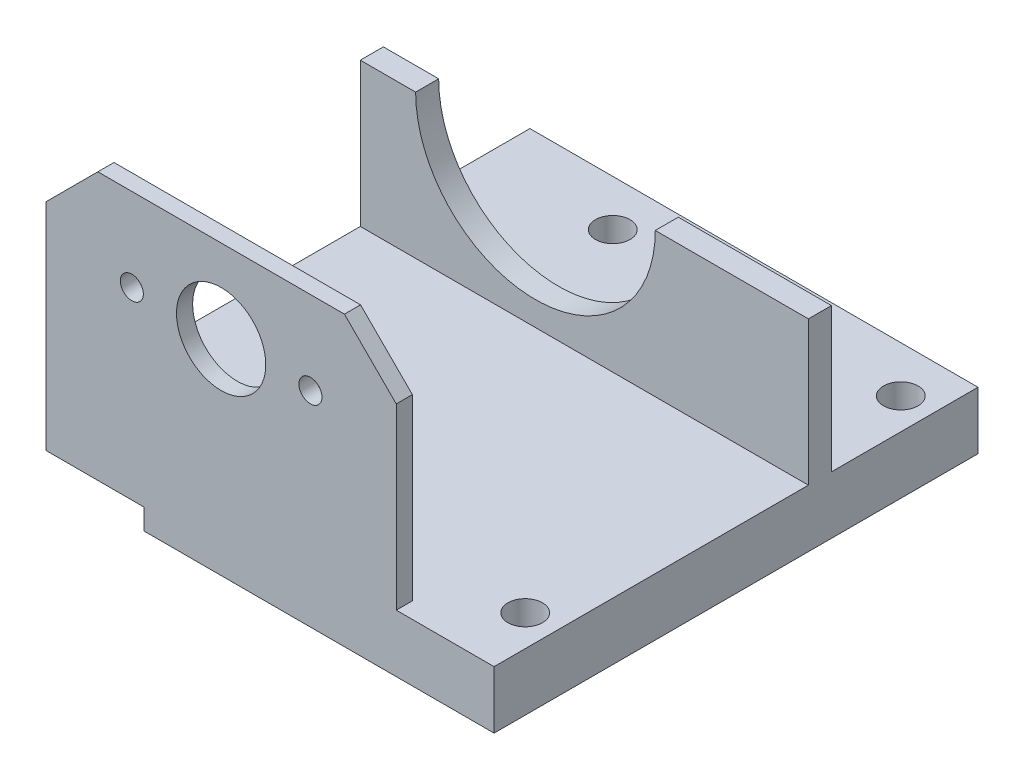
ISO-10303-21;
HEADER;
FILE_DESCRIPTION(('STEP AP214'),'2;1');
FILE_NAME('part.step','',(''),(''),'','','');
FILE_SCHEMA(('AUTOMOTIVE_DESIGN { 1 0 10303 214 1 1 1 1 }'));
ENDSEC;
DATA;
#1=APPLICATION_CONTEXT('core data for automotive mechanical design processes');
#2=APPLICATION_PROTOCOL_DEFINITION('international standard','automotive_design',2000,#1);
#3=PRODUCT_CONTEXT('',#1,'mechanical');
#4=PRODUCT('Part','Part','',(#3));
#5=PRODUCT_RELATED_PRODUCT_CATEGORY('part','',(#4));
#6=PRODUCT_DEFINITION_FORMATION('','',#4);
#7=PRODUCT_DEFINITION_CONTEXT('part definition',#1,'design');
#8=PRODUCT_DEFINITION('design','',#6,#7);
#9=PRODUCT_DEFINITION_SHAPE('','',#8);
#10=(LENGTH_UNIT() NAMED_UNIT(*) SI_UNIT(.MILLI.,.METRE.));
#11=(NAMED_UNIT(*) PLANE_ANGLE_UNIT() SI_UNIT($,.RADIAN.));
#12=(NAMED_UNIT(*) SI_UNIT($,.STERADIAN.) SOLID_ANGLE_UNIT());
#13=UNCERTAINTY_MEASURE_WITH_UNIT(LENGTH_MEASURE(1.E-05),#10,'distance_accuracy_value','');
#14=(GEOMETRIC_REPRESENTATION_CONTEXT(3) GLOBAL_UNCERTAINTY_ASSIGNED_CONTEXT((#13)) GLOBAL_UNIT_ASSIGNED_CONTEXT((#10,
#11,#12)) REPRESENTATION_CONTEXT('',''));
#15=CARTESIAN_POINT('',(0.,0.,0.));
#16=DIRECTION('',(0.,0.,1.));
#17=DIRECTION('',(1.,0.,0.));
#18=AXIS2_PLACEMENT_3D('',#15,#16,#17);
#19=CARTESIAN_POINT('',(0.,17.5,0.));
#20=DIRECTION('',(0.,1.,0.));
#21=DIRECTION('',(0.,0.,1.));
#22=AXIS2_PLACEMENT_3D('',#19,#20,#21);
#23=PLANE('',#22);
#24=DIRECTION('',(0.,0.,-1.));
#25=VECTOR('',#24,1.);
#26=CARTESIAN_POINT('',(1.91,17.5,-6.28));
#27=LINE('',#26,#25);
#28=CARTESIAN_POINT('',(1.91,17.5,-6.28));
#29=VERTEX_POINT('',#28);
#30=CARTESIAN_POINT('',(1.91,17.5,-8.28));
#31=VERTEX_POINT('',#30);
#32=EDGE_CURVE('E11',#29,#31,#27,.T.);
#33=ORIENTED_EDGE('',*,*,#32,.F.);
#34=DIRECTION('',(1.,0.,0.));
#35=VECTOR('',#34,1.);
#36=CARTESIAN_POINT('',(-23.69,17.5,-6.28));
#37=LINE('',#36,#35);
#38=CARTESIAN_POINT('',(15.2,17.5,-6.28));
#39=VERTEX_POINT('',#38);
#40=EDGE_CURVE('E318',#29,#39,#37,.T.);
#41=ORIENTED_EDGE('',*,*,#40,.T.);
#42=DIRECTION('',(0.,0.,-1.));
#43=VECTOR('',#42,1.);
#44=CARTESIAN_POINT('',(15.2,17.5,-8.28));
#45=LINE('',#44,#43);
#46=CARTESIAN_POINT('',(15.2,17.5,-8.28));
#47=VERTEX_POINT('',#46);
#48=EDGE_CURVE('E164',#39,#47,#45,.T.);
#49=ORIENTED_EDGE('',*,*,#48,.T.);
#50=DIRECTION('',(-1.,0.,0.));
#51=VECTOR('',#50,1.);
#52=CARTESIAN_POINT('',(-23.69,17.5,-8.28));
#53=LINE('',#52,#51);
#54=EDGE_CURVE('E160',#47,#31,#53,.T.);
#55=ORIENTED_EDGE('',*,*,#54,.T.);
#56=EDGE_LOOP('',(#33,#41,#49,#55));
#57=FACE_BOUND('',#56,.T.);
#58=ADVANCED_FACE('F33',(#57),#23,.T.);
#59=CARTESIAN_POINT('',(0.,5.,0.));
#60=DIRECTION('',(0.,1.,0.));
#61=DIRECTION('',(0.,0.,1.));
#62=AXIS2_PLACEMENT_3D('',#59,#60,#61);
#63=PLANE('',#62);
#64=CARTESIAN_POINT('',(-12.5,5.,15.6));
#65=DIRECTION('',(0.,1.,0.));
#66=DIRECTION('',(0.,0.,1.));
#67=AXIS2_PLACEMENT_3D('',#64,#65,#66);
#68=CIRCLE('',#67,1.5);
#69=CARTESIAN_POINT('',(-12.5,5.,17.1));
#70=VERTEX_POINT('',#69);
#71=EDGE_CURVE('E187',#70,#70,#68,.T.);
#72=ORIENTED_EDGE('',*,*,#71,.F.);
#73=EDGE_LOOP('',(#72));
#74=FACE_BOUND('',#73,.T.);
#75=CARTESIAN_POINT('',(12.5,5.,15.6));
#76=DIRECTION('',(0.,1.,0.));
#77=DIRECTION('',(0.,0.,1.));
#78=AXIS2_PLACEMENT_3D('',#75,#76,#77);
#79=CIRCLE('',#78,1.5);
#80=CARTESIAN_POINT('',(12.5,5.,17.1));
#81=VERTEX_POINT('',#80);
#82=EDGE_CURVE('E193',#81,#81,#79,.T.);
#83=ORIENTED_EDGE('',*,*,#82,.F.);
#84=EDGE_LOOP('',(#83));
#85=FACE_BOUND('',#84,.T.);
#86=DIRECTION('',(0.,0.,-1.));
#87=VECTOR('',#86,1.);
#88=CARTESIAN_POINT('',(15.2,5.,-21.));
#89=LINE('',#88,#87);
#90=CARTESIAN_POINT('',(15.2,5.,21.));
#91=VERTEX_POINT('',#90);
#92=CARTESIAN_POINT('',(15.2,5.,-6.28));
#93=VERTEX_POINT('',#92);
#94=EDGE_CURVE('E265',#91,#93,#89,.T.);
#95=ORIENTED_EDGE('',*,*,#94,.T.);
#96=DIRECTION('',(1.,0.,0.));
#97=VECTOR('',#96,1.);
#98=CARTESIAN_POINT('',(-23.69,5.,-6.28));
#99=LINE('',#98,#97);
#100=CARTESIAN_POINT('',(-23.69,5.,-6.28));
#101=VERTEX_POINT('',#100);
#102=EDGE_CURVE('E172',#101,#93,#99,.T.);
#103=ORIENTED_EDGE('',*,*,#102,.F.);
#104=DIRECTION('',(0.,0.,-1.));
#105=VECTOR('',#104,1.);
#106=CARTESIAN_POINT('',(-23.69,5.,-21.));
#107=LINE('',#106,#105);
#108=CARTESIAN_POINT('',(-23.69,5.,19.6));
#109=VERTEX_POINT('',#108);
#110=EDGE_CURVE('E253',#109,#101,#107,.T.);
#111=ORIENTED_EDGE('',*,*,#110,.F.);
#112=DIRECTION('',(-1.,0.,0.));
#113=VECTOR('',#112,1.);
#114=CARTESIAN_POINT('',(-23.69,5.,19.6));
#115=LINE('',#114,#113);
#116=CARTESIAN_POINT('',(6.71,5.,19.6));
#117=VERTEX_POINT('',#116);
#118=EDGE_CURVE('E230',#117,#109,#115,.T.);
#119=ORIENTED_EDGE('',*,*,#118,.F.);
#120=DIRECTION('',(0.,0.,-1.));
#121=VECTOR('',#120,1.);
#122=CARTESIAN_POINT('',(6.71,5.,21.));
#123=LINE('',#122,#121);
#124=CARTESIAN_POINT('',(6.71,5.,21.));
#125=VERTEX_POINT('',#124);
#126=EDGE_CURVE('E223',#125,#117,#123,.T.);
#127=ORIENTED_EDGE('',*,*,#126,.F.);
#128=DIRECTION('',(1.,0.,0.));
#129=VECTOR('',#128,1.);
#130=CARTESIAN_POINT('',(-15.2,5.,21.));
#131=LINE('',#130,#129);
#132=EDGE_CURVE('E272',#125,#91,#131,.T.);
#133=ORIENTED_EDGE('',*,*,#132,.T.);
#134=EDGE_LOOP('',(#95,#103,#111,#119,#127,#133));
#135=FACE_BOUND('',#134,.T.);
#136=ADVANCED_FACE('F370',(#74,#85,#135),#63,.T.);
#137=CARTESIAN_POINT('',(-12.5,5.,-17.));
#138=DIRECTION('',(0.,1.,0.));
#139=DIRECTION('',(0.,0.,1.));
#140=AXIS2_PLACEMENT_3D('',#137,#138,#139);
#141=CIRCLE('',#140,1.5);
#142=CARTESIAN_POINT('',(-12.5,5.,-15.5));
#143=VERTEX_POINT('',#142);
#144=EDGE_CURVE('E183',#143,#143,#141,.T.);
#145=ORIENTED_EDGE('',*,*,#144,.F.);
#146=EDGE_LOOP('',(#145));
#147=FACE_BOUND('',#146,.T.);
#148=CARTESIAN_POINT('',(12.5,5.,-17.));
#149=DIRECTION('',(0.,1.,0.));
#150=DIRECTION('',(0.,0.,1.));
#151=AXIS2_PLACEMENT_3D('',#148,#149,#150);
#152=CIRCLE('',#151,1.5);
#153=CARTESIAN_POINT('',(12.5,5.,-15.5));
#154=VERTEX_POINT('',#153);
#155=EDGE_CURVE('E194',#154,#154,#152,.T.);
#156=ORIENTED_EDGE('',*,*,#155,.F.);
#157=EDGE_LOOP('',(#156));
#158=FACE_BOUND('',#157,.T.);
#159=CARTESIAN_POINT('',(-23.69,5.,-8.28));
#160=VERTEX_POINT('',#159);
#161=CARTESIAN_POINT('',(-23.69,5.,-21.));
#162=VERTEX_POINT('',#161);
#163=EDGE_CURVE('E252',#160,#162,#107,.T.);
#164=ORIENTED_EDGE('',*,*,#163,.F.);
#165=DIRECTION('',(-1.,0.,0.));
#166=VECTOR('',#165,1.);
#167=CARTESIAN_POINT('',(-23.69,5.,-8.28));
#168=LINE('',#167,#166);
#169=CARTESIAN_POINT('',(15.2,5.,-8.28));
#170=VERTEX_POINT('',#169);
#171=EDGE_CURVE('E174',#170,#160,#168,.T.);
#172=ORIENTED_EDGE('',*,*,#171,.F.);
#173=CARTESIAN_POINT('',(15.2,5.,-21.));
#174=VERTEX_POINT('',#173);
#175=EDGE_CURVE('E269',#170,#174,#89,.T.);
#176=ORIENTED_EDGE('',*,*,#175,.T.);
#177=DIRECTION('',(-1.,0.,0.));
#178=VECTOR('',#177,1.);
#179=CARTESIAN_POINT('',(-15.2,5.,-21.));
#180=LINE('',#179,#178);
#181=EDGE_CURVE('E268',#174,#162,#180,.T.);
#182=ORIENTED_EDGE('',*,*,#181,.T.);
#183=EDGE_LOOP('',(#164,#172,#176,#182));
#184=FACE_BOUND('',#183,.T.);
#185=ADVANCED_FACE('F332',(#147,#158,#184),#63,.T.);
#186=CARTESIAN_POINT('',(-15.2,5.,-21.));
#187=DIRECTION('',(1.,0.,0.));
#188=DIRECTION('',(0.,0.,-1.));
#189=AXIS2_PLACEMENT_3D('',#186,#187,#188);
#190=PLANE('',#189);
#191=DIRECTION('',(0.,0.,1.));
#192=VECTOR('',#191,1.);
#193=CARTESIAN_POINT('',(-15.2,1.8,-21.));
#194=LINE('',#193,#192);
#195=CARTESIAN_POINT('',(-15.2,1.8,-21.));
#196=VERTEX_POINT('',#195);
#197=CARTESIAN_POINT('',(-15.2,1.8,21.));
#198=VERTEX_POINT('',#197);
#199=EDGE_CURVE('E243',#196,#198,#194,.T.);
#200=ORIENTED_EDGE('',*,*,#199,.F.);
#201=DIRECTION('',(0.,-1.,0.));
#202=VECTOR('',#201,1.);
#203=CARTESIAN_POINT('',(-15.2,5.,-21.));
#204=LINE('',#203,#202);
#205=CARTESIAN_POINT('',(-15.2,0.,-21.));
#206=VERTEX_POINT('',#205);
#207=EDGE_CURVE('E289',#196,#206,#204,.T.);
#208=ORIENTED_EDGE('',*,*,#207,.T.);
#209=DIRECTION('',(0.,0.,1.));
#210=VECTOR('',#209,1.);
#211=CARTESIAN_POINT('',(-15.2,0.,-21.));
#212=LINE('',#211,#210);
#213=CARTESIAN_POINT('',(-15.2,0.,21.));
#214=VERTEX_POINT('',#213);
#215=EDGE_CURVE('E280',#206,#214,#212,.T.);
#216=ORIENTED_EDGE('',*,*,#215,.T.);
#217=DIRECTION('',(0.,-1.,0.));
#218=VECTOR('',#217,1.);
#219=CARTESIAN_POINT('',(-15.2,5.,21.));
#220=LINE('',#219,#218);
#221=EDGE_CURVE('E287',#198,#214,#220,.T.);
#222=ORIENTED_EDGE('',*,*,#221,.F.);
#223=EDGE_LOOP('',(#200,#208,#216,#222));
#224=FACE_BOUND('',#223,.T.);
#225=ADVANCED_FACE('F379',(#224),#190,.F.);
#226=CARTESIAN_POINT('',(15.2,5.,-21.));
#227=DIRECTION('',(-1.,0.,0.));
#228=DIRECTION('',(0.,0.,1.));
#229=AXIS2_PLACEMENT_3D('',#226,#227,#228);
#230=PLANE('',#229);
#231=DIRECTION('',(0.,0.,-1.));
#232=VECTOR('',#231,1.);
#233=CARTESIAN_POINT('',(15.2,0.,-21.));
#234=LINE('',#233,#232);
#235=CARTESIAN_POINT('',(15.2,0.,21.));
#236=VERTEX_POINT('',#235);
#237=CARTESIAN_POINT('',(15.2,0.,-21.));
#238=VERTEX_POINT('',#237);
#239=EDGE_CURVE('E264',#236,#238,#234,.T.);
#240=ORIENTED_EDGE('',*,*,#239,.T.);
#241=DIRECTION('',(0.,-1.,0.));
#242=VECTOR('',#241,1.);
#243=CARTESIAN_POINT('',(15.2,5.,-21.));
#244=LINE('',#243,#242);
#245=EDGE_CURVE('E291',#174,#238,#244,.T.);
#246=ORIENTED_EDGE('',*,*,#245,.F.);
#247=ORIENTED_EDGE('',*,*,#175,.F.);
#248=DIRECTION('',(0.,-1.,0.));
#249=VECTOR('',#248,1.);
#250=CARTESIAN_POINT('',(15.2,17.5,-8.28));
#251=LINE('',#250,#249);
#252=EDGE_CURVE('E167',#47,#170,#251,.T.);
#253=ORIENTED_EDGE('',*,*,#252,.F.);
#254=ORIENTED_EDGE('',*,*,#48,.F.);
#255=DIRECTION('',(0.,-1.,0.));
#256=VECTOR('',#255,1.);
#257=CARTESIAN_POINT('',(15.2,17.5,-6.28));
#258=LINE('',#257,#256);
#259=EDGE_CURVE('E178',#39,#93,#258,.T.);
#260=ORIENTED_EDGE('',*,*,#259,.T.);
#261=ORIENTED_EDGE('',*,*,#94,.F.);
#262=DIRECTION('',(0.,-1.,0.));
#263=VECTOR('',#262,1.);
#264=CARTESIAN_POINT('',(15.2,5.,21.));
#265=LINE('',#264,#263);
#266=EDGE_CURVE('E274',#91,#236,#265,.T.);
#267=ORIENTED_EDGE('',*,*,#266,.T.);
#268=EDGE_LOOP('',(#240,#246,#247,#253,#254,#260,#261,#267));
#269=FACE_BOUND('',#268,.T.);
#270=ADVANCED_FACE('F326',(#269),#230,.F.);
#271=CARTESIAN_POINT('',(-15.2,5.,-21.));
#272=DIRECTION('',(0.,0.,1.));
#273=DIRECTION('',(1.,0.,0.));
#274=AXIS2_PLACEMENT_3D('',#271,#272,#273);
#275=PLANE('',#274);
#276=DIRECTION('',(-1.,0.,0.));
#277=VECTOR('',#276,1.);
#278=CARTESIAN_POINT('',(-15.2,0.,-21.));
#279=LINE('',#278,#277);
#280=EDGE_CURVE('E277',#238,#206,#279,.T.);
#281=ORIENTED_EDGE('',*,*,#280,.T.);
#282=ORIENTED_EDGE('',*,*,#207,.F.);
#283=DIRECTION('',(1.,0.,0.));
#284=VECTOR('',#283,1.);
#285=CARTESIAN_POINT('',(-23.69,1.8,-21.));
#286=LINE('',#285,#284);
#287=CARTESIAN_POINT('',(-23.69,1.8,-21.));
#288=VERTEX_POINT('',#287);
#289=EDGE_CURVE('E261',#288,#196,#286,.T.);
#290=ORIENTED_EDGE('',*,*,#289,.F.);
#291=DIRECTION('',(0.,-1.,0.));
#292=VECTOR('',#291,1.);
#293=CARTESIAN_POINT('',(-23.69,5.,-21.));
#294=LINE('',#293,#292);
#295=EDGE_CURVE('E244',#162,#288,#294,.T.);
#296=ORIENTED_EDGE('',*,*,#295,.F.);
#297=ORIENTED_EDGE('',*,*,#181,.F.);
#298=ORIENTED_EDGE('',*,*,#245,.T.);
#299=EDGE_LOOP('',(#281,#282,#290,#296,#297,#298));
#300=FACE_BOUND('',#299,.T.);
#301=ADVANCED_FACE('F340',(#300),#275,.F.);
#302=CARTESIAN_POINT('',(-15.2,5.,21.));
#303=DIRECTION('',(0.,0.,-1.));
#304=DIRECTION('',(-1.,0.,0.));
#305=AXIS2_PLACEMENT_3D('',#302,#303,#304);
#306=PLANE('',#305);
#307=CARTESIAN_POINT('',(-16.24,17.78,21.));
#308=DIRECTION('',(0.,0.,-1.));
#309=DIRECTION('',(-1.,0.,0.));
#310=AXIS2_PLACEMENT_3D('',#307,#308,#309);
#311=CIRCLE('',#310,1.);
#312=CARTESIAN_POINT('',(-17.24,17.78,21.));
#313=VERTEX_POINT('',#312);
#314=EDGE_CURVE('E215',#313,#313,#311,.T.);
#315=ORIENTED_EDGE('',*,*,#314,.T.);
#316=EDGE_LOOP('',(#315));
#317=FACE_BOUND('',#316,.T.);
#318=CARTESIAN_POINT('',(-0.739999999999996,17.78,21.));
#319=DIRECTION('',(0.,0.,-1.));
#320=DIRECTION('',(-1.,0.,0.));
#321=AXIS2_PLACEMENT_3D('',#318,#319,#320);
#322=CIRCLE('',#321,1.);
#323=CARTESIAN_POINT('',(-1.74,17.78,21.));
#324=VERTEX_POINT('',#323);
#325=EDGE_CURVE('E208',#324,#324,#322,.T.);
#326=ORIENTED_EDGE('',*,*,#325,.T.);
#327=EDGE_LOOP('',(#326));
#328=FACE_BOUND('',#327,.T.);
#329=CARTESIAN_POINT('',(-8.48999999999999,17.78,21.));
#330=DIRECTION('',(0.,0.,-1.));
#331=DIRECTION('',(-1.,0.,0.));
#332=AXIS2_PLACEMENT_3D('',#329,#330,#331);
#333=CIRCLE('',#332,3.875);
#334=CARTESIAN_POINT('',(-12.365,17.78,21.));
#335=VERTEX_POINT('',#334);
#336=EDGE_CURVE('E220',#335,#335,#333,.T.);
#337=ORIENTED_EDGE('',*,*,#336,.T.);
#338=EDGE_LOOP('',(#337));
#339=FACE_BOUND('',#338,.T.);
#340=DIRECTION('',(1.,0.,0.));
#341=VECTOR('',#340,1.);
#342=CARTESIAN_POINT('',(-23.69,25.,21.));
#343=LINE('',#342,#341);
#344=CARTESIAN_POINT('',(-19.19,25.,21.));
#345=VERTEX_POINT('',#344);
#346=CARTESIAN_POINT('',(2.20999999999999,25.,21.));
#347=VERTEX_POINT('',#346);
#348=EDGE_CURVE('E226',#345,#347,#343,.T.);
#349=ORIENTED_EDGE('',*,*,#348,.F.);
#350=DIRECTION('',(-0.707106781186546,-0.707106781186549,0.));
#351=VECTOR('',#350,1.);
#352=CARTESIAN_POINT('',(-19.19,25.,21.));
#353=LINE('',#352,#351);
#354=CARTESIAN_POINT('',(-23.69,20.5,21.));
#355=VERTEX_POINT('',#354);
#356=EDGE_CURVE('E302',#345,#355,#353,.T.);
#357=ORIENTED_EDGE('',*,*,#356,.T.);
#358=DIRECTION('',(0.,1.,0.));
#359=VECTOR('',#358,1.);
#360=CARTESIAN_POINT('',(-23.69,5.,21.));
#361=LINE('',#360,#359);
#362=CARTESIAN_POINT('',(-23.69,1.8,21.));
#363=VERTEX_POINT('',#362);
#364=EDGE_CURVE('E249',#363,#355,#361,.T.);
#365=ORIENTED_EDGE('',*,*,#364,.F.);
#366=DIRECTION('',(1.,0.,0.));
#367=VECTOR('',#366,1.);
#368=CARTESIAN_POINT('',(-23.69,1.8,21.));
#369=LINE('',#368,#367);
#370=EDGE_CURVE('E256',#363,#198,#369,.T.);
#371=ORIENTED_EDGE('',*,*,#370,.T.);
#372=ORIENTED_EDGE('',*,*,#221,.T.);
#373=DIRECTION('',(1.,0.,0.));
#374=VECTOR('',#373,1.);
#375=CARTESIAN_POINT('',(-15.2,0.,21.));
#376=LINE('',#375,#374);
#377=EDGE_CURVE('E283',#214,#236,#376,.T.);
#378=ORIENTED_EDGE('',*,*,#377,.T.);
#379=ORIENTED_EDGE('',*,*,#266,.F.);
#380=ORIENTED_EDGE('',*,*,#132,.F.);
#381=DIRECTION('',(0.,-1.,0.));
#382=VECTOR('',#381,1.);
#383=CARTESIAN_POINT('',(6.71,25.,21.));
#384=LINE('',#383,#382);
#385=CARTESIAN_POINT('',(6.71,20.5,21.));
#386=VERTEX_POINT('',#385);
#387=EDGE_CURVE('E241',#386,#125,#384,.T.);
#388=ORIENTED_EDGE('',*,*,#387,.F.);
#389=DIRECTION('',(0.707106781186546,-0.707106781186549,0.));
#390=VECTOR('',#389,1.);
#391=CARTESIAN_POINT('',(2.21,25.,21.));
#392=LINE('',#391,#390);
#393=EDGE_CURVE('E300',#386,#347,#392,.F.);
#394=ORIENTED_EDGE('',*,*,#393,.T.);
#395=EDGE_LOOP('',(#349,#357,#365,#371,#372,#378,#379,#380,#388,#394));
#396=FACE_BOUND('',#395,.T.);
#397=ADVANCED_FACE('F346',(#317,#328,#339,#396),#306,.F.);
#398=CARTESIAN_POINT('',(0.,0.,0.));
#399=DIRECTION('',(0.,1.,0.));
#400=DIRECTION('',(0.,0.,1.));
#401=AXIS2_PLACEMENT_3D('',#398,#399,#400);
#402=PLANE('',#401);
#403=CARTESIAN_POINT('',(12.5,0.,-17.));
#404=DIRECTION('',(0.,1.,0.));
#405=DIRECTION('',(0.,0.,1.));
#406=AXIS2_PLACEMENT_3D('',#403,#404,#405);
#407=CIRCLE('',#406,1.5);
#408=CARTESIAN_POINT('',(12.5,0.,-15.5));
#409=VERTEX_POINT('',#408);
#410=EDGE_CURVE('E190',#409,#409,#407,.T.);
#411=ORIENTED_EDGE('',*,*,#410,.T.);
#412=EDGE_LOOP('',(#411));
#413=FACE_BOUND('',#412,.T.);
#414=CARTESIAN_POINT('',(-12.5,0.,15.6));
#415=DIRECTION('',(0.,1.,0.));
#416=DIRECTION('',(0.,0.,1.));
#417=AXIS2_PLACEMENT_3D('',#414,#415,#416);
#418=CIRCLE('',#417,1.5);
#419=CARTESIAN_POINT('',(-12.5,0.,17.1));
#420=VERTEX_POINT('',#419);
#421=EDGE_CURVE('E197',#420,#420,#418,.T.);
#422=ORIENTED_EDGE('',*,*,#421,.T.);
#423=EDGE_LOOP('',(#422));
#424=FACE_BOUND('',#423,.T.);
#425=CARTESIAN_POINT('',(-12.5,0.,-17.));
#426=DIRECTION('',(0.,1.,0.));
#427=DIRECTION('',(0.,0.,1.));
#428=AXIS2_PLACEMENT_3D('',#425,#426,#427);
#429=CIRCLE('',#428,1.5);
#430=CARTESIAN_POINT('',(-12.5,0.,-15.5));
#431=VERTEX_POINT('',#430);
#432=EDGE_CURVE('E184',#431,#431,#429,.T.);
#433=ORIENTED_EDGE('',*,*,#432,.T.);
#434=EDGE_LOOP('',(#433));
#435=FACE_BOUND('',#434,.T.);
#436=CARTESIAN_POINT('',(12.5,0.,15.6));
#437=DIRECTION('',(0.,1.,0.));
#438=DIRECTION('',(0.,0.,1.));
#439=AXIS2_PLACEMENT_3D('',#436,#437,#438);
#440=CIRCLE('',#439,1.5);
#441=CARTESIAN_POINT('',(12.5,0.,17.1));
#442=VERTEX_POINT('',#441);
#443=EDGE_CURVE('E202',#442,#442,#440,.T.);
#444=ORIENTED_EDGE('',*,*,#443,.T.);
#445=EDGE_LOOP('',(#444));
#446=FACE_BOUND('',#445,.T.);
#447=ORIENTED_EDGE('',*,*,#239,.F.);
#448=ORIENTED_EDGE('',*,*,#377,.F.);
#449=ORIENTED_EDGE('',*,*,#215,.F.);
#450=ORIENTED_EDGE('',*,*,#280,.F.);
#451=EDGE_LOOP('',(#447,#448,#449,#450));
#452=FACE_BOUND('',#451,.T.);
#453=ADVANCED_FACE('F376',(#413,#424,#435,#446,#452),#402,.F.);
#454=CARTESIAN_POINT('',(-23.69,1.8,-21.));
#455=DIRECTION('',(0.,1.,0.));
#456=DIRECTION('',(0.,0.,1.));
#457=AXIS2_PLACEMENT_3D('',#454,#455,#456);
#458=PLANE('',#457);
#459=ORIENTED_EDGE('',*,*,#199,.T.);
#460=ORIENTED_EDGE('',*,*,#370,.F.);
#461=DIRECTION('',(0.,0.,1.));
#462=VECTOR('',#461,1.);
#463=CARTESIAN_POINT('',(-23.69,1.8,-21.));
#464=LINE('',#463,#462);
#465=EDGE_CURVE('E247',#288,#363,#464,.T.);
#466=ORIENTED_EDGE('',*,*,#465,.F.);
#467=ORIENTED_EDGE('',*,*,#289,.T.);
#468=EDGE_LOOP('',(#459,#460,#466,#467));
#469=FACE_BOUND('',#468,.T.);
#470=ADVANCED_FACE('F342',(#469),#458,.F.);
#471=CARTESIAN_POINT('',(-23.69,0.,0.));
#472=DIRECTION('',(-1.,0.,0.));
#473=DIRECTION('',(0.,0.,1.));
#474=AXIS2_PLACEMENT_3D('',#471,#472,#473);
#475=PLANE('',#474);
#476=ORIENTED_EDGE('',*,*,#364,.T.);
#477=DIRECTION('',(0.,0.,-1.));
#478=VECTOR('',#477,1.);
#479=CARTESIAN_POINT('',(-23.69,20.5,19.6));
#480=LINE('',#479,#478);
#481=CARTESIAN_POINT('',(-23.69,20.5,19.6));
#482=VERTEX_POINT('',#481);
#483=EDGE_CURVE('E304',#355,#482,#480,.T.);
#484=ORIENTED_EDGE('',*,*,#483,.T.);
#485=DIRECTION('',(0.,-1.,0.));
#486=VECTOR('',#485,1.);
#487=CARTESIAN_POINT('',(-23.69,25.,19.6));
#488=LINE('',#487,#486);
#489=EDGE_CURVE('E233',#482,#109,#488,.T.);
#490=ORIENTED_EDGE('',*,*,#489,.T.);
#491=ORIENTED_EDGE('',*,*,#110,.T.);
#492=DIRECTION('',(0.,-1.,0.));
#493=VECTOR('',#492,1.);
#494=CARTESIAN_POINT('',(-23.69,17.5,-6.28));
#495=LINE('',#494,#493);
#496=CARTESIAN_POINT('',(-23.69,17.5,-6.28));
#497=VERTEX_POINT('',#496);
#498=EDGE_CURVE('E181',#497,#101,#495,.T.);
#499=ORIENTED_EDGE('',*,*,#498,.F.);
#500=DIRECTION('',(0.,0.,1.));
#501=VECTOR('',#500,1.);
#502=CARTESIAN_POINT('',(-23.69,17.5,-8.28));
#503=LINE('',#502,#501);
#504=CARTESIAN_POINT('',(-23.69,17.5,-8.28));
#505=VERTEX_POINT('',#504);
#506=EDGE_CURVE('E175',#505,#497,#503,.T.);
#507=ORIENTED_EDGE('',*,*,#506,.F.);
#508=DIRECTION('',(0.,-1.,0.));
#509=VECTOR('',#508,1.);
#510=CARTESIAN_POINT('',(-23.69,17.5,-8.28));
#511=LINE('',#510,#509);
#512=EDGE_CURVE('E55',#505,#160,#511,.T.);
#513=ORIENTED_EDGE('',*,*,#512,.T.);
#514=ORIENTED_EDGE('',*,*,#163,.T.);
#515=ORIENTED_EDGE('',*,*,#295,.T.);
#516=ORIENTED_EDGE('',*,*,#465,.T.);
#517=EDGE_LOOP('',(#476,#484,#490,#491,#499,#507,#513,#514,#515,#516));
#518=FACE_BOUND('',#517,.T.);
#519=ADVANCED_FACE('F335',(#518),#475,.T.);
#520=CARTESIAN_POINT('',(6.71,25.,21.));
#521=DIRECTION('',(-1.,0.,0.));
#522=DIRECTION('',(0.,0.,1.));
#523=AXIS2_PLACEMENT_3D('',#520,#521,#522);
#524=PLANE('',#523);
#525=DIRECTION('',(0.,-1.,0.));
#526=VECTOR('',#525,1.);
#527=CARTESIAN_POINT('',(6.71,25.,19.6));
#528=LINE('',#527,#526);
#529=CARTESIAN_POINT('',(6.71,20.5,19.6));
#530=VERTEX_POINT('',#529);
#531=EDGE_CURVE('E239',#530,#117,#528,.T.);
#532=ORIENTED_EDGE('',*,*,#531,.F.);
#533=DIRECTION('',(0.,0.,1.));
#534=VECTOR('',#533,1.);
#535=CARTESIAN_POINT('',(6.71,20.5,21.));
#536=LINE('',#535,#534);
#537=EDGE_CURVE('E310',#530,#386,#536,.T.);
#538=ORIENTED_EDGE('',*,*,#537,.T.);
#539=ORIENTED_EDGE('',*,*,#387,.T.);
#540=ORIENTED_EDGE('',*,*,#126,.T.);
#541=EDGE_LOOP('',(#532,#538,#539,#540));
#542=FACE_BOUND('',#541,.T.);
#543=ADVANCED_FACE('F365',(#542),#524,.F.);
#544=CARTESIAN_POINT('',(-23.69,25.,19.6));
#545=DIRECTION('',(0.,0.,1.));
#546=DIRECTION('',(1.,0.,0.));
#547=AXIS2_PLACEMENT_3D('',#544,#545,#546);
#548=PLANE('',#547);
#549=CARTESIAN_POINT('',(-16.24,17.78,19.6));
#550=DIRECTION('',(0.,0.,-1.));
#551=DIRECTION('',(-1.,0.,0.));
#552=AXIS2_PLACEMENT_3D('',#549,#550,#551);
#553=CIRCLE('',#552,1.);
#554=CARTESIAN_POINT('',(-17.24,17.78,19.6));
#555=VERTEX_POINT('',#554);
#556=EDGE_CURVE('E205',#555,#555,#553,.T.);
#557=ORIENTED_EDGE('',*,*,#556,.F.);
#558=EDGE_LOOP('',(#557));
#559=FACE_BOUND('',#558,.T.);
#560=CARTESIAN_POINT('',(-0.739999999999996,17.78,19.6));
#561=DIRECTION('',(0.,0.,-1.));
#562=DIRECTION('',(-1.,0.,0.));
#563=AXIS2_PLACEMENT_3D('',#560,#561,#562);
#564=CIRCLE('',#563,1.);
#565=CARTESIAN_POINT('',(-1.74,17.78,19.6));
#566=VERTEX_POINT('',#565);
#567=EDGE_CURVE('E212',#566,#566,#564,.T.);
#568=ORIENTED_EDGE('',*,*,#567,.F.);
#569=EDGE_LOOP('',(#568));
#570=FACE_BOUND('',#569,.T.);
#571=CARTESIAN_POINT('',(-8.48999999999999,17.78,19.6));
#572=DIRECTION('',(0.,0.,-1.));
#573=DIRECTION('',(-1.,0.,0.));
#574=AXIS2_PLACEMENT_3D('',#571,#572,#573);
#575=CIRCLE('',#574,3.875);
#576=CARTESIAN_POINT('',(-12.365,17.78,19.6));
#577=VERTEX_POINT('',#576);
#578=EDGE_CURVE('E211',#577,#577,#575,.T.);
#579=ORIENTED_EDGE('',*,*,#578,.F.);
#580=EDGE_LOOP('',(#579));
#581=FACE_BOUND('',#580,.T.);
#582=ORIENTED_EDGE('',*,*,#489,.F.);
#583=DIRECTION('',(0.707106781186546,0.707106781186549,0.));
#584=VECTOR('',#583,1.);
#585=CARTESIAN_POINT('',(-19.19,25.,19.6));
#586=LINE('',#585,#584);
#587=CARTESIAN_POINT('',(-19.19,25.,19.6));
#588=VERTEX_POINT('',#587);
#589=EDGE_CURVE('E308',#482,#588,#586,.T.);
#590=ORIENTED_EDGE('',*,*,#589,.T.);
#591=DIRECTION('',(-1.,0.,0.));
#592=VECTOR('',#591,1.);
#593=CARTESIAN_POINT('',(-23.69,25.,19.6));
#594=LINE('',#593,#592);
#595=CARTESIAN_POINT('',(2.20999999999999,25.,19.6));
#596=VERTEX_POINT('',#595);
#597=EDGE_CURVE('E229',#596,#588,#594,.T.);
#598=ORIENTED_EDGE('',*,*,#597,.F.);
#599=DIRECTION('',(-0.707106781186546,0.707106781186549,0.));
#600=VECTOR('',#599,1.);
#601=CARTESIAN_POINT('',(2.21,25.,19.6));
#602=LINE('',#601,#600);
#603=EDGE_CURVE('E306',#596,#530,#602,.F.);
#604=ORIENTED_EDGE('',*,*,#603,.T.);
#605=ORIENTED_EDGE('',*,*,#531,.T.);
#606=ORIENTED_EDGE('',*,*,#118,.T.);
#607=EDGE_LOOP('',(#582,#590,#598,#604,#605,#606));
#608=FACE_BOUND('',#607,.T.);
#609=ADVANCED_FACE('F355',(#559,#570,#581,#608),#548,.F.);
#610=CARTESIAN_POINT('',(0.,25.,0.));
#611=DIRECTION('',(0.,-1.,0.));
#612=DIRECTION('',(0.,0.,-1.));
#613=AXIS2_PLACEMENT_3D('',#610,#611,#612);
#614=PLANE('',#613);
#615=ORIENTED_EDGE('',*,*,#597,.T.);
#616=DIRECTION('',(0.,0.,1.));
#617=VECTOR('',#616,1.);
#618=CARTESIAN_POINT('',(-19.19,25.,21.));
#619=LINE('',#618,#617);
#620=EDGE_CURVE('E297',#588,#345,#619,.T.);
#621=ORIENTED_EDGE('',*,*,#620,.T.);
#622=ORIENTED_EDGE('',*,*,#348,.T.);
#623=DIRECTION('',(0.,0.,-1.));
#624=VECTOR('',#623,1.);
#625=CARTESIAN_POINT('',(2.21,25.,0.));
#626=LINE('',#625,#624);
#627=EDGE_CURVE('E294',#347,#596,#626,.T.);
#628=ORIENTED_EDGE('',*,*,#627,.T.);
#629=EDGE_LOOP('',(#615,#621,#622,#628));
#630=FACE_BOUND('',#629,.T.);
#631=ADVANCED_FACE('F357',(#630),#614,.F.);
#632=CARTESIAN_POINT('',(-8.48999999999999,17.78,21.));
#633=DIRECTION('',(0.,0.,-1.));
#634=DIRECTION('',(-1.,0.,0.));
#635=AXIS2_PLACEMENT_3D('',#632,#633,#634);
#636=CYLINDRICAL_SURFACE('',#635,3.875);
#637=ORIENTED_EDGE('',*,*,#336,.F.);
#638=EDGE_LOOP('',(#637));
#639=FACE_BOUND('',#638,.T.);
#640=ORIENTED_EDGE('',*,*,#578,.T.);
#641=EDGE_LOOP('',(#640));
#642=FACE_BOUND('',#641,.T.);
#643=ADVANCED_FACE('F429',(#639,#642),#636,.F.);
#644=CARTESIAN_POINT('',(-0.739999999999996,17.78,21.));
#645=DIRECTION('',(0.,0.,-1.));
#646=DIRECTION('',(-1.,0.,0.));
#647=AXIS2_PLACEMENT_3D('',#644,#645,#646);
#648=CYLINDRICAL_SURFACE('',#647,1.);
#649=ORIENTED_EDGE('',*,*,#325,.F.);
#650=EDGE_LOOP('',(#649));
#651=FACE_BOUND('',#650,.T.);
#652=ORIENTED_EDGE('',*,*,#567,.T.);
#653=EDGE_LOOP('',(#652));
#654=FACE_BOUND('',#653,.T.);
#655=ADVANCED_FACE('F425',(#651,#654),#648,.F.);
#656=CARTESIAN_POINT('',(-16.24,17.78,21.));
#657=DIRECTION('',(0.,0.,-1.));
#658=DIRECTION('',(-1.,0.,0.));
#659=AXIS2_PLACEMENT_3D('',#656,#657,#658);
#660=CYLINDRICAL_SURFACE('',#659,1.);
#661=ORIENTED_EDGE('',*,*,#314,.F.);
#662=EDGE_LOOP('',(#661));
#663=FACE_BOUND('',#662,.T.);
#664=ORIENTED_EDGE('',*,*,#556,.T.);
#665=EDGE_LOOP('',(#664));
#666=FACE_BOUND('',#665,.T.);
#667=ADVANCED_FACE('F428',(#663,#666),#660,.F.);
#668=CARTESIAN_POINT('',(-19.19,25.,0.));
#669=DIRECTION('',(-0.707106781186549,0.707106781186546,0.));
#670=DIRECTION('',(0.,0.,-1.));
#671=AXIS2_PLACEMENT_3D('',#668,#669,#670);
#672=PLANE('',#671);
#673=ORIENTED_EDGE('',*,*,#589,.F.);
#674=ORIENTED_EDGE('',*,*,#483,.F.);
#675=ORIENTED_EDGE('',*,*,#356,.F.);
#676=ORIENTED_EDGE('',*,*,#620,.F.);
#677=EDGE_LOOP('',(#673,#674,#675,#676));
#678=FACE_BOUND('',#677,.T.);
#679=ADVANCED_FACE('F351',(#678),#672,.T.);
#680=CARTESIAN_POINT('',(2.21,25.,0.));
#681=DIRECTION('',(-0.707106781186549,-0.707106781186546,0.));
#682=DIRECTION('',(0.,0.,-1.));
#683=AXIS2_PLACEMENT_3D('',#680,#681,#682);
#684=PLANE('',#683);
#685=ORIENTED_EDGE('',*,*,#393,.F.);
#686=ORIENTED_EDGE('',*,*,#537,.F.);
#687=ORIENTED_EDGE('',*,*,#603,.F.);
#688=ORIENTED_EDGE('',*,*,#627,.F.);
#689=EDGE_LOOP('',(#685,#686,#687,#688));
#690=FACE_BOUND('',#689,.T.);
#691=ADVANCED_FACE('F35',(#690),#684,.F.);
#692=CARTESIAN_POINT('',(12.5,0.,15.6));
#693=DIRECTION('',(0.,1.,0.));
#694=DIRECTION('',(0.,0.,1.));
#695=AXIS2_PLACEMENT_3D('',#692,#693,#694);
#696=CYLINDRICAL_SURFACE('',#695,1.5);
#697=ORIENTED_EDGE('',*,*,#443,.F.);
#698=EDGE_LOOP('',(#697));
#699=FACE_BOUND('',#698,.T.);
#700=ORIENTED_EDGE('',*,*,#82,.T.);
#701=EDGE_LOOP('',(#700));
#702=FACE_BOUND('',#701,.T.);
#703=ADVANCED_FACE('F414',(#699,#702),#696,.F.);
#704=CARTESIAN_POINT('',(-12.5,0.,-17.));
#705=DIRECTION('',(0.,1.,0.));
#706=DIRECTION('',(0.,0.,1.));
#707=AXIS2_PLACEMENT_3D('',#704,#705,#706);
#708=CYLINDRICAL_SURFACE('',#707,1.5);
#709=ORIENTED_EDGE('',*,*,#432,.F.);
#710=EDGE_LOOP('',(#709));
#711=FACE_BOUND('',#710,.T.);
#712=ORIENTED_EDGE('',*,*,#144,.T.);
#713=EDGE_LOOP('',(#712));
#714=FACE_BOUND('',#713,.T.);
#715=ADVANCED_FACE('F410',(#711,#714),#708,.F.);
#716=CARTESIAN_POINT('',(-12.5,0.,15.6));
#717=DIRECTION('',(0.,1.,0.));
#718=DIRECTION('',(0.,0.,1.));
#719=AXIS2_PLACEMENT_3D('',#716,#717,#718);
#720=CYLINDRICAL_SURFACE('',#719,1.5);
#721=ORIENTED_EDGE('',*,*,#421,.F.);
#722=EDGE_LOOP('',(#721));
#723=FACE_BOUND('',#722,.T.);
#724=ORIENTED_EDGE('',*,*,#71,.T.);
#725=EDGE_LOOP('',(#724));
#726=FACE_BOUND('',#725,.T.);
#727=ADVANCED_FACE('F413',(#723,#726),#720,.F.);
#728=CARTESIAN_POINT('',(12.5,0.,-17.));
#729=DIRECTION('',(0.,1.,0.));
#730=DIRECTION('',(0.,0.,1.));
#731=AXIS2_PLACEMENT_3D('',#728,#729,#730);
#732=CYLINDRICAL_SURFACE('',#731,1.5);
#733=ORIENTED_EDGE('',*,*,#410,.F.);
#734=EDGE_LOOP('',(#733));
#735=FACE_BOUND('',#734,.T.);
#736=ORIENTED_EDGE('',*,*,#155,.T.);
#737=EDGE_LOOP('',(#736));
#738=FACE_BOUND('',#737,.T.);
#739=ADVANCED_FACE('F407',(#735,#738),#732,.F.);
#740=CARTESIAN_POINT('',(-23.69,17.5,-6.28));
#741=DIRECTION('',(0.,0.,-1.));
#742=DIRECTION('',(-1.,0.,0.));
#743=AXIS2_PLACEMENT_3D('',#740,#741,#742);
#744=PLANE('',#743);
#745=ORIENTED_EDGE('',*,*,#40,.F.);
#746=CARTESIAN_POINT('',(-8.49,17.5,-6.28));
#747=DIRECTION('',(0.,0.,-1.));
#748=DIRECTION('',(-1.,0.,0.));
#749=AXIS2_PLACEMENT_3D('',#746,#747,#748);
#750=CIRCLE('',#749,10.4);
#751=CARTESIAN_POINT('',(-18.89,17.5,-6.28));
#752=VERTEX_POINT('',#751);
#753=EDGE_CURVE('E152',#29,#752,#750,.T.);
#754=ORIENTED_EDGE('',*,*,#753,.T.);
#755=EDGE_CURVE('E315',#497,#752,#37,.T.);
#756=ORIENTED_EDGE('',*,*,#755,.F.);
#757=ORIENTED_EDGE('',*,*,#498,.T.);
#758=ORIENTED_EDGE('',*,*,#102,.T.);
#759=ORIENTED_EDGE('',*,*,#259,.F.);
#760=EDGE_LOOP('',(#745,#754,#756,#757,#758,#759));
#761=FACE_BOUND('',#760,.T.);
#762=ADVANCED_FACE('F314',(#761),#744,.F.);
#763=CARTESIAN_POINT('',(-23.69,17.5,-8.28));
#764=DIRECTION('',(0.,0.,1.));
#765=DIRECTION('',(1.,0.,0.));
#766=AXIS2_PLACEMENT_3D('',#763,#764,#765);
#767=PLANE('',#766);
#768=CARTESIAN_POINT('',(-18.89,17.5,-8.28));
#769=VERTEX_POINT('',#768);
#770=EDGE_CURVE('E161',#769,#505,#53,.T.);
#771=ORIENTED_EDGE('',*,*,#770,.F.);
#772=CARTESIAN_POINT('',(-8.49,17.5,-8.28));
#773=DIRECTION('',(0.,0.,-1.));
#774=DIRECTION('',(-1.,0.,0.));
#775=AXIS2_PLACEMENT_3D('',#772,#773,#774);
#776=CIRCLE('',#775,10.4);
#777=EDGE_CURVE('E47',#31,#769,#776,.T.);
#778=ORIENTED_EDGE('',*,*,#777,.F.);
#779=ORIENTED_EDGE('',*,*,#54,.F.);
#780=ORIENTED_EDGE('',*,*,#252,.T.);
#781=ORIENTED_EDGE('',*,*,#171,.T.);
#782=ORIENTED_EDGE('',*,*,#512,.F.);
#783=EDGE_LOOP('',(#771,#778,#779,#780,#781,#782));
#784=FACE_BOUND('',#783,.T.);
#785=ADVANCED_FACE('F159',(#784),#767,.F.);
#786=DIRECTION('',(0.,0.,-1.));
#787=VECTOR('',#786,1.);
#788=CARTESIAN_POINT('',(-18.89,17.5,-6.28));
#789=LINE('',#788,#787);
#790=EDGE_CURVE('E41',#769,#752,#789,.F.);
#791=ORIENTED_EDGE('',*,*,#790,.F.);
#792=ORIENTED_EDGE('',*,*,#770,.T.);
#793=ORIENTED_EDGE('',*,*,#506,.T.);
#794=ORIENTED_EDGE('',*,*,#755,.T.);
#795=EDGE_LOOP('',(#791,#792,#793,#794));
#796=FACE_BOUND('',#795,.T.);
#797=ADVANCED_FACE('F320',(#796),#23,.T.);
#798=CARTESIAN_POINT('',(-8.49,17.5,-6.28));
#799=DIRECTION('',(0.,0.,-1.));
#800=DIRECTION('',(-1.,0.,0.));
#801=AXIS2_PLACEMENT_3D('',#798,#799,#800);
#802=CYLINDRICAL_SURFACE('',#801,10.4);
#803=ORIENTED_EDGE('',*,*,#32,.T.);
#804=ORIENTED_EDGE('',*,*,#777,.T.);
#805=ORIENTED_EDGE('',*,*,#790,.T.);
#806=ORIENTED_EDGE('',*,*,#753,.F.);
#807=EDGE_LOOP('',(#803,#804,#805,#806));
#808=FACE_BOUND('',#807,.T.);
#809=ADVANCED_FACE('F150',(#808),#802,.F.);
#810=CLOSED_SHELL('',(#58,#136,#185,#225,#270,#301,#397,#453,#470,#519,#543,#609,#631,#643,#655,
#667,#679,#691,#703,#715,#727,#739,#762,#785,#797,#809));
#811=MANIFOLD_SOLID_BREP('B2',#810);
#812=ADVANCED_BREP_SHAPE_REPRESENTATION('',(#18,#811),#14);
#813=SHAPE_DEFINITION_REPRESENTATION(#9,#812);
ENDSEC;
END-ISO-10303-21;
